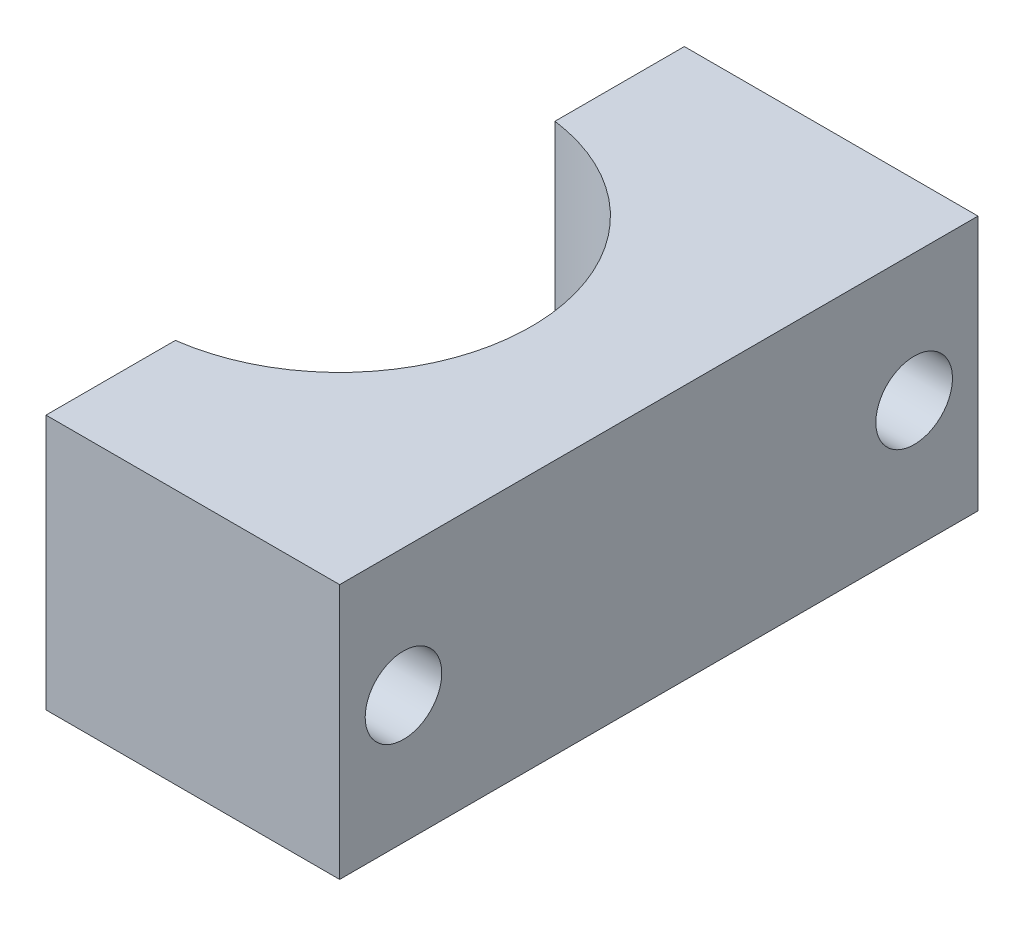
ISO-10303-21;
HEADER;
FILE_DESCRIPTION(('STEP AP214'),'2;1');
FILE_NAME('part.step','',(''),(''),'','','');
FILE_SCHEMA(('AUTOMOTIVE_DESIGN { 1 0 10303 214 1 1 1 1 }'));
ENDSEC;
DATA;
#1=APPLICATION_CONTEXT('core data for automotive mechanical design processes');
#2=APPLICATION_PROTOCOL_DEFINITION('international standard','automotive_design',2000,#1);
#3=PRODUCT_CONTEXT('',#1,'mechanical');
#4=PRODUCT('Part','Part','',(#3));
#5=PRODUCT_RELATED_PRODUCT_CATEGORY('part','',(#4));
#6=PRODUCT_DEFINITION_FORMATION('','',#4);
#7=PRODUCT_DEFINITION_CONTEXT('part definition',#1,'design');
#8=PRODUCT_DEFINITION('design','',#6,#7);
#9=PRODUCT_DEFINITION_SHAPE('','',#8);
#10=(LENGTH_UNIT() NAMED_UNIT(*) SI_UNIT(.MILLI.,.METRE.));
#11=(NAMED_UNIT(*) PLANE_ANGLE_UNIT() SI_UNIT($,.RADIAN.));
#12=(NAMED_UNIT(*) SI_UNIT($,.STERADIAN.) SOLID_ANGLE_UNIT());
#13=UNCERTAINTY_MEASURE_WITH_UNIT(LENGTH_MEASURE(1.E-05),#10,'distance_accuracy_value','');
#14=(GEOMETRIC_REPRESENTATION_CONTEXT(3) GLOBAL_UNCERTAINTY_ASSIGNED_CONTEXT((#13)) GLOBAL_UNIT_ASSIGNED_CONTEXT((#10,
#11,#12)) REPRESENTATION_CONTEXT('',''));
#15=CARTESIAN_POINT('',(0.,0.,0.));
#16=DIRECTION('',(0.,0.,1.));
#17=DIRECTION('',(1.,0.,0.));
#18=AXIS2_PLACEMENT_3D('',#15,#16,#17);
#19=CARTESIAN_POINT('',(-12.5,10.,12.5));
#20=DIRECTION('',(0.,0.,-1.));
#21=DIRECTION('',(-1.,0.,0.));
#22=AXIS2_PLACEMENT_3D('',#19,#20,#21);
#23=PLANE('',#22);
#24=DIRECTION('',(1.,0.,0.));
#25=VECTOR('',#24,1.);
#26=CARTESIAN_POINT('',(-12.5,10.,12.5));
#27=LINE('',#26,#25);
#28=CARTESIAN_POINT('',(1.00000000000001,10.,12.5));
#29=VERTEX_POINT('',#28);
#30=CARTESIAN_POINT('',(12.5,10.,12.5));
#31=VERTEX_POINT('',#30);
#32=EDGE_CURVE('E97',#29,#31,#27,.T.);
#33=ORIENTED_EDGE('',*,*,#32,.F.);
#34=DIRECTION('',(0.,1.,0.));
#35=VECTOR('',#34,1.);
#36=CARTESIAN_POINT('',(1.00000000000001,0.,12.5));
#37=LINE('',#36,#35);
#38=CARTESIAN_POINT('',(1.00000000000001,0.,12.5));
#39=VERTEX_POINT('',#38);
#40=EDGE_CURVE('E86',#39,#29,#37,.T.);
#41=ORIENTED_EDGE('',*,*,#40,.F.);
#42=DIRECTION('',(1.,0.,0.));
#43=VECTOR('',#42,1.);
#44=CARTESIAN_POINT('',(-12.5,0.,12.5));
#45=LINE('',#44,#43);
#46=CARTESIAN_POINT('',(12.5,0.,12.5));
#47=VERTEX_POINT('',#46);
#48=EDGE_CURVE('E96',#39,#47,#45,.T.);
#49=ORIENTED_EDGE('',*,*,#48,.T.);
#50=DIRECTION('',(0.,-1.,0.));
#51=VECTOR('',#50,1.);
#52=CARTESIAN_POINT('',(12.5,10.,12.5));
#53=LINE('',#52,#51);
#54=EDGE_CURVE('E11',#31,#47,#53,.T.);
#55=ORIENTED_EDGE('',*,*,#54,.F.);
#56=EDGE_LOOP('',(#33,#41,#49,#55));
#57=FACE_BOUND('',#56,.T.);
#58=ADVANCED_FACE('F32',(#57),#23,.F.);
#59=CARTESIAN_POINT('',(12.5,10.,12.5));
#60=DIRECTION('',(-1.,0.,0.));
#61=DIRECTION('',(0.,0.,1.));
#62=AXIS2_PLACEMENT_3D('',#59,#60,#61);
#63=PLANE('',#62);
#64=CARTESIAN_POINT('',(12.5,5.,-10.));
#65=DIRECTION('',(-1.,0.,0.));
#66=DIRECTION('',(0.,0.,1.));
#67=AXIS2_PLACEMENT_3D('',#64,#65,#66);
#68=CIRCLE('',#67,1.5);
#69=CARTESIAN_POINT('',(12.5,5.,-8.5));
#70=VERTEX_POINT('',#69);
#71=EDGE_CURVE('E128',#70,#70,#68,.T.);
#72=ORIENTED_EDGE('',*,*,#71,.T.);
#73=EDGE_LOOP('',(#72));
#74=FACE_BOUND('',#73,.T.);
#75=CARTESIAN_POINT('',(12.5,5.,10.));
#76=DIRECTION('',(-1.,0.,0.));
#77=DIRECTION('',(0.,0.,1.));
#78=AXIS2_PLACEMENT_3D('',#75,#76,#77);
#79=CIRCLE('',#78,1.5);
#80=CARTESIAN_POINT('',(12.5,5.,11.5));
#81=VERTEX_POINT('',#80);
#82=EDGE_CURVE('E130',#81,#81,#79,.T.);
#83=ORIENTED_EDGE('',*,*,#82,.T.);
#84=EDGE_LOOP('',(#83));
#85=FACE_BOUND('',#84,.T.);
#86=DIRECTION('',(0.,0.,-1.));
#87=VECTOR('',#86,1.);
#88=CARTESIAN_POINT('',(12.5,0.,12.5));
#89=LINE('',#88,#87);
#90=CARTESIAN_POINT('',(12.5,0.,-12.5));
#91=VERTEX_POINT('',#90);
#92=EDGE_CURVE('E103',#47,#91,#89,.T.);
#93=ORIENTED_EDGE('',*,*,#92,.T.);
#94=DIRECTION('',(0.,-1.,0.));
#95=VECTOR('',#94,1.);
#96=CARTESIAN_POINT('',(12.5,10.,-12.5));
#97=LINE('',#96,#95);
#98=CARTESIAN_POINT('',(12.5,10.,-12.5));
#99=VERTEX_POINT('',#98);
#100=EDGE_CURVE('E40',#99,#91,#97,.T.);
#101=ORIENTED_EDGE('',*,*,#100,.F.);
#102=DIRECTION('',(0.,0.,-1.));
#103=VECTOR('',#102,1.);
#104=CARTESIAN_POINT('',(12.5,10.,12.5));
#105=LINE('',#104,#103);
#106=EDGE_CURVE('E121',#31,#99,#105,.T.);
#107=ORIENTED_EDGE('',*,*,#106,.F.);
#108=ORIENTED_EDGE('',*,*,#54,.T.);
#109=EDGE_LOOP('',(#93,#101,#107,#108));
#110=FACE_BOUND('',#109,.T.);
#111=ADVANCED_FACE('F151',(#74,#85,#110),#63,.F.);
#112=CARTESIAN_POINT('',(-12.5,10.,-12.5));
#113=DIRECTION('',(0.,0.,1.));
#114=DIRECTION('',(1.,0.,0.));
#115=AXIS2_PLACEMENT_3D('',#112,#113,#114);
#116=PLANE('',#115);
#117=DIRECTION('',(-1.,0.,0.));
#118=VECTOR('',#117,1.);
#119=CARTESIAN_POINT('',(-12.5,0.,-12.5));
#120=LINE('',#119,#118);
#121=CARTESIAN_POINT('',(1.00000000000001,0.,-12.5));
#122=VERTEX_POINT('',#121);
#123=EDGE_CURVE('E106',#91,#122,#120,.T.);
#124=ORIENTED_EDGE('',*,*,#123,.T.);
#125=DIRECTION('',(0.,1.,0.));
#126=VECTOR('',#125,1.);
#127=CARTESIAN_POINT('',(1.00000000000001,0.,-12.5));
#128=LINE('',#127,#126);
#129=CARTESIAN_POINT('',(1.00000000000001,10.,-12.5));
#130=VERTEX_POINT('',#129);
#131=EDGE_CURVE('E98',#122,#130,#128,.T.);
#132=ORIENTED_EDGE('',*,*,#131,.T.);
#133=DIRECTION('',(-1.,0.,0.));
#134=VECTOR('',#133,1.);
#135=CARTESIAN_POINT('',(-12.5,10.,-12.5));
#136=LINE('',#135,#134);
#137=EDGE_CURVE('E111',#99,#130,#136,.T.);
#138=ORIENTED_EDGE('',*,*,#137,.F.);
#139=ORIENTED_EDGE('',*,*,#100,.T.);
#140=EDGE_LOOP('',(#124,#132,#138,#139));
#141=FACE_BOUND('',#140,.T.);
#142=ADVANCED_FACE('F146',(#141),#116,.F.);
#143=CARTESIAN_POINT('',(0.,10.,0.));
#144=DIRECTION('',(0.,-1.,0.));
#145=DIRECTION('',(0.,0.,-1.));
#146=AXIS2_PLACEMENT_3D('',#143,#144,#145);
#147=PLANE('',#146);
#148=ORIENTED_EDGE('',*,*,#137,.T.);
#149=DIRECTION('',(0.,0.,-1.));
#150=VECTOR('',#149,1.);
#151=CARTESIAN_POINT('',(1.00000000000001,10.,0.));
#152=LINE('',#151,#150);
#153=CARTESIAN_POINT('',(1.00000000000001,10.,-7.43303437365925));
#154=VERTEX_POINT('',#153);
#155=EDGE_CURVE('E143',#154,#130,#152,.T.);
#156=ORIENTED_EDGE('',*,*,#155,.F.);
#157=CARTESIAN_POINT('',(0.,10.,0.));
#158=DIRECTION('',(0.,1.,0.));
#159=DIRECTION('',(0.,0.,1.));
#160=AXIS2_PLACEMENT_3D('',#157,#158,#159);
#161=CIRCLE('',#160,7.5);
#162=CARTESIAN_POINT('',(1.00000000000001,10.,7.43303437365925));
#163=VERTEX_POINT('',#162);
#164=EDGE_CURVE('E108',#163,#154,#161,.T.);
#165=ORIENTED_EDGE('',*,*,#164,.F.);
#166=EDGE_CURVE('E55',#29,#163,#152,.T.);
#167=ORIENTED_EDGE('',*,*,#166,.F.);
#168=ORIENTED_EDGE('',*,*,#32,.T.);
#169=ORIENTED_EDGE('',*,*,#106,.T.);
#170=EDGE_LOOP('',(#148,#156,#165,#167,#168,#169));
#171=FACE_BOUND('',#170,.T.);
#172=ADVANCED_FACE('F149',(#171),#147,.F.);
#173=CARTESIAN_POINT('',(0.,0.,0.));
#174=DIRECTION('',(0.,-1.,0.));
#175=DIRECTION('',(0.,0.,-1.));
#176=AXIS2_PLACEMENT_3D('',#173,#174,#175);
#177=PLANE('',#176);
#178=DIRECTION('',(0.,0.,-1.));
#179=VECTOR('',#178,1.);
#180=CARTESIAN_POINT('',(1.00000000000001,0.,0.));
#181=LINE('',#180,#179);
#182=CARTESIAN_POINT('',(1.00000000000001,0.,-7.43303437365925));
#183=VERTEX_POINT('',#182);
#184=EDGE_CURVE('E47',#183,#122,#181,.T.);
#185=ORIENTED_EDGE('',*,*,#184,.T.);
#186=ORIENTED_EDGE('',*,*,#123,.F.);
#187=ORIENTED_EDGE('',*,*,#92,.F.);
#188=ORIENTED_EDGE('',*,*,#48,.F.);
#189=CARTESIAN_POINT('',(1.00000000000001,0.,7.43303437365925));
#190=VERTEX_POINT('',#189);
#191=EDGE_CURVE('E83',#39,#190,#181,.T.);
#192=ORIENTED_EDGE('',*,*,#191,.T.);
#193=CARTESIAN_POINT('',(0.,0.,0.));
#194=DIRECTION('',(0.,1.,0.));
#195=DIRECTION('',(0.,0.,1.));
#196=AXIS2_PLACEMENT_3D('',#193,#194,#195);
#197=CIRCLE('',#196,7.5);
#198=EDGE_CURVE('E104',#190,#183,#197,.T.);
#199=ORIENTED_EDGE('',*,*,#198,.T.);
#200=EDGE_LOOP('',(#185,#186,#187,#188,#192,#199));
#201=FACE_BOUND('',#200,.T.);
#202=ADVANCED_FACE('F101',(#201),#177,.T.);
#203=CARTESIAN_POINT('',(0.,0.,0.));
#204=DIRECTION('',(0.,1.,0.));
#205=DIRECTION('',(0.,0.,1.));
#206=AXIS2_PLACEMENT_3D('',#203,#204,#205);
#207=CYLINDRICAL_SURFACE('',#206,7.5);
#208=ORIENTED_EDGE('',*,*,#164,.T.);
#209=DIRECTION('',(0.,1.,0.));
#210=VECTOR('',#209,1.);
#211=CARTESIAN_POINT('',(1.00000000000001,0.,-7.43303437365925));
#212=LINE('',#211,#210);
#213=EDGE_CURVE('E133',#154,#183,#212,.F.);
#214=ORIENTED_EDGE('',*,*,#213,.T.);
#215=ORIENTED_EDGE('',*,*,#198,.F.);
#216=DIRECTION('',(0.,1.,0.));
#217=VECTOR('',#216,1.);
#218=CARTESIAN_POINT('',(1.00000000000001,0.,7.43303437365925));
#219=LINE('',#218,#217);
#220=EDGE_CURVE('E87',#190,#163,#219,.T.);
#221=ORIENTED_EDGE('',*,*,#220,.T.);
#222=EDGE_LOOP('',(#208,#214,#215,#221));
#223=FACE_BOUND('',#222,.T.);
#224=ADVANCED_FACE('F148',(#223),#207,.F.);
#225=CARTESIAN_POINT('',(12.5,5.,-10.));
#226=DIRECTION('',(-1.,0.,0.));
#227=DIRECTION('',(0.,0.,1.));
#228=AXIS2_PLACEMENT_3D('',#225,#226,#227);
#229=CYLINDRICAL_SURFACE('',#228,1.5);
#230=CARTESIAN_POINT('',(1.00000000000001,5.,-10.));
#231=DIRECTION('',(1.,0.,0.));
#232=DIRECTION('',(0.,0.,-1.));
#233=AXIS2_PLACEMENT_3D('',#230,#231,#232);
#234=CIRCLE('',#233,1.5);
#235=CARTESIAN_POINT('',(1.00000000000001,5.,-11.5));
#236=VERTEX_POINT('',#235);
#237=EDGE_CURVE('E138',#236,#236,#234,.F.);
#238=ORIENTED_EDGE('',*,*,#237,.T.);
#239=EDGE_LOOP('',(#238));
#240=FACE_BOUND('',#239,.T.);
#241=ORIENTED_EDGE('',*,*,#71,.F.);
#242=EDGE_LOOP('',(#241));
#243=FACE_BOUND('',#242,.T.);
#244=ADVANCED_FACE('F167',(#240,#243),#229,.F.);
#245=CARTESIAN_POINT('',(12.5,5.,10.));
#246=DIRECTION('',(-1.,0.,0.));
#247=DIRECTION('',(0.,0.,1.));
#248=AXIS2_PLACEMENT_3D('',#245,#246,#247);
#249=CYLINDRICAL_SURFACE('',#248,1.5);
#250=CARTESIAN_POINT('',(1.00000000000001,5.,10.));
#251=DIRECTION('',(1.,0.,0.));
#252=DIRECTION('',(0.,0.,-1.));
#253=AXIS2_PLACEMENT_3D('',#250,#251,#252);
#254=CIRCLE('',#253,1.5);
#255=CARTESIAN_POINT('',(1.00000000000001,5.,8.5));
#256=VERTEX_POINT('',#255);
#257=EDGE_CURVE('E35',#256,#256,#254,.F.);
#258=ORIENTED_EDGE('',*,*,#257,.T.);
#259=EDGE_LOOP('',(#258));
#260=FACE_BOUND('',#259,.T.);
#261=ORIENTED_EDGE('',*,*,#82,.F.);
#262=EDGE_LOOP('',(#261));
#263=FACE_BOUND('',#262,.T.);
#264=ADVANCED_FACE('F168',(#260,#263),#249,.F.);
#265=CARTESIAN_POINT('',(1.00000000000001,0.,0.));
#266=DIRECTION('',(1.,0.,0.));
#267=DIRECTION('',(0.,0.,-1.));
#268=AXIS2_PLACEMENT_3D('',#265,#266,#267);
#269=PLANE('',#268);
#270=ORIENTED_EDGE('',*,*,#257,.F.);
#271=EDGE_LOOP('',(#270));
#272=FACE_BOUND('',#271,.T.);
#273=ORIENTED_EDGE('',*,*,#191,.F.);
#274=ORIENTED_EDGE('',*,*,#40,.T.);
#275=ORIENTED_EDGE('',*,*,#166,.T.);
#276=ORIENTED_EDGE('',*,*,#220,.F.);
#277=EDGE_LOOP('',(#273,#274,#275,#276));
#278=FACE_BOUND('',#277,.T.);
#279=ADVANCED_FACE('F85',(#272,#278),#269,.F.);
#280=ORIENTED_EDGE('',*,*,#237,.F.);
#281=EDGE_LOOP('',(#280));
#282=FACE_BOUND('',#281,.T.);
#283=ORIENTED_EDGE('',*,*,#155,.T.);
#284=ORIENTED_EDGE('',*,*,#131,.F.);
#285=ORIENTED_EDGE('',*,*,#184,.F.);
#286=ORIENTED_EDGE('',*,*,#213,.F.);
#287=EDGE_LOOP('',(#283,#284,#285,#286));
#288=FACE_BOUND('',#287,.T.);
#289=ADVANCED_FACE('F144',(#282,#288),#269,.F.);
#290=CLOSED_SHELL('',(#58,#111,#142,#172,#202,#224,#244,#264,#279,#289));
#291=MANIFOLD_SOLID_BREP('B2',#290);
#292=ADVANCED_BREP_SHAPE_REPRESENTATION('',(#18,#291),#14);
#293=SHAPE_DEFINITION_REPRESENTATION(#9,#292);
ENDSEC;
END-ISO-10303-21;
